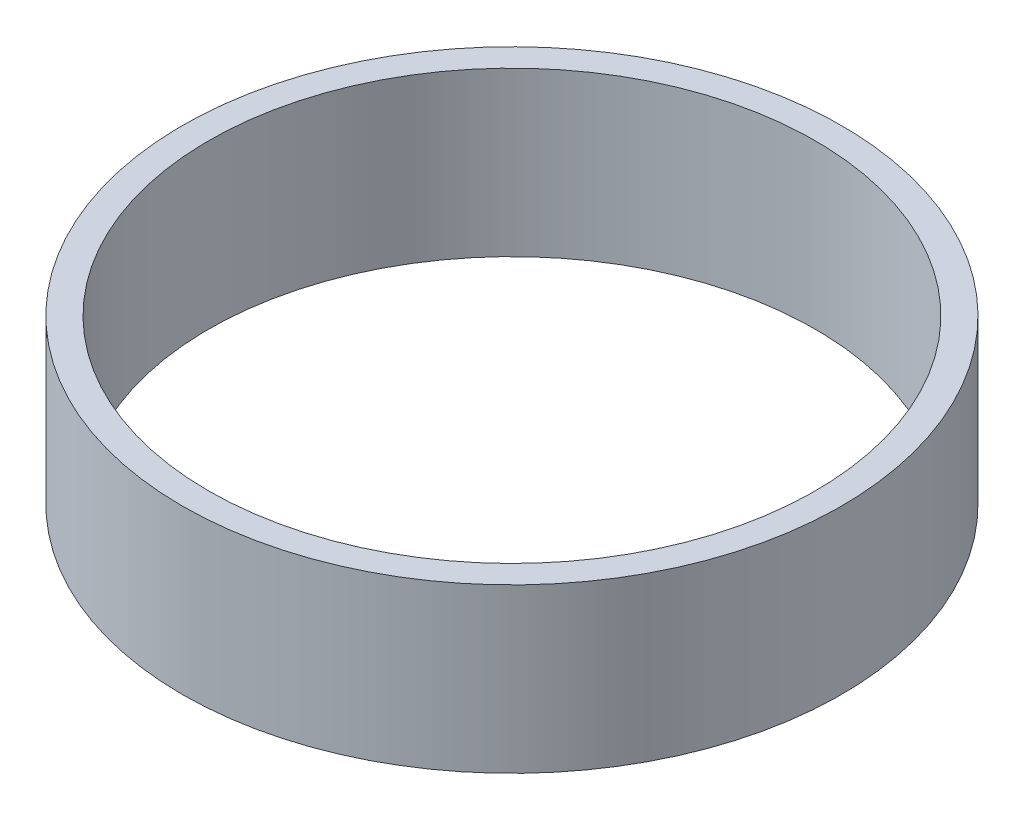
ISO-10303-21;
HEADER;
FILE_DESCRIPTION(('STEP AP214'),'2;1');
FILE_NAME('part.step','',(''),(''),'','','');
FILE_SCHEMA(('AUTOMOTIVE_DESIGN { 1 0 10303 214 1 1 1 1 }'));
ENDSEC;
DATA;
#1=APPLICATION_CONTEXT('core data for automotive mechanical design processes');
#2=APPLICATION_PROTOCOL_DEFINITION('international standard','automotive_design',2000,#1);
#3=PRODUCT_CONTEXT('',#1,'mechanical');
#4=PRODUCT('Part','Part','',(#3));
#5=PRODUCT_RELATED_PRODUCT_CATEGORY('part','',(#4));
#6=PRODUCT_DEFINITION_FORMATION('','',#4);
#7=PRODUCT_DEFINITION_CONTEXT('part definition',#1,'design');
#8=PRODUCT_DEFINITION('design','',#6,#7);
#9=PRODUCT_DEFINITION_SHAPE('','',#8);
#10=(LENGTH_UNIT() NAMED_UNIT(*) SI_UNIT(.MILLI.,.METRE.));
#11=(NAMED_UNIT(*) PLANE_ANGLE_UNIT() SI_UNIT($,.RADIAN.));
#12=(NAMED_UNIT(*) SI_UNIT($,.STERADIAN.) SOLID_ANGLE_UNIT());
#13=UNCERTAINTY_MEASURE_WITH_UNIT(LENGTH_MEASURE(1.E-05),#10,'distance_accuracy_value','');
#14=(GEOMETRIC_REPRESENTATION_CONTEXT(3) GLOBAL_UNCERTAINTY_ASSIGNED_CONTEXT((#13)) GLOBAL_UNIT_ASSIGNED_CONTEXT((#10,
#11,#12)) REPRESENTATION_CONTEXT('',''));
#15=CARTESIAN_POINT('',(0.,0.,0.));
#16=DIRECTION('',(0.,0.,1.));
#17=DIRECTION('',(1.,0.,0.));
#18=AXIS2_PLACEMENT_3D('',#15,#16,#17);
#19=CARTESIAN_POINT('',(0.,6.,0.));
#20=DIRECTION('',(0.,-1.,0.));
#21=DIRECTION('',(0.,0.,-1.));
#22=AXIS2_PLACEMENT_3D('',#19,#20,#21);
#23=CYLINDRICAL_SURFACE('',#22,12.115);
#24=CARTESIAN_POINT('',(0.,6.,0.));
#25=DIRECTION('',(0.,1.,0.));
#26=DIRECTION('',(0.,0.,1.));
#27=AXIS2_PLACEMENT_3D('',#24,#25,#26);
#28=CIRCLE('',#27,12.115);
#29=CARTESIAN_POINT('',(0.,6.,12.115));
#30=VERTEX_POINT('',#29);
#31=EDGE_CURVE('E10',#30,#30,#28,.T.);
#32=ORIENTED_EDGE('',*,*,#31,.F.);
#33=EDGE_LOOP('',(#32));
#34=FACE_BOUND('',#33,.T.);
#35=CARTESIAN_POINT('',(0.,0.,0.));
#36=DIRECTION('',(0.,1.,0.));
#37=DIRECTION('',(0.,0.,1.));
#38=AXIS2_PLACEMENT_3D('',#35,#36,#37);
#39=CIRCLE('',#38,12.115);
#40=CARTESIAN_POINT('',(0.,0.,12.115));
#41=VERTEX_POINT('',#40);
#42=EDGE_CURVE('E41',#41,#41,#39,.T.);
#43=ORIENTED_EDGE('',*,*,#42,.T.);
#44=EDGE_LOOP('',(#43));
#45=FACE_BOUND('',#44,.T.);
#46=ADVANCED_FACE('F34',(#34,#45),#23,.T.);
#47=CARTESIAN_POINT('',(0.,6.,0.));
#48=DIRECTION('',(0.,1.,0.));
#49=DIRECTION('',(0.,0.,1.));
#50=AXIS2_PLACEMENT_3D('',#47,#48,#49);
#51=PLANE('',#50);
#52=CARTESIAN_POINT('',(0.,6.,0.));
#53=DIRECTION('',(0.,1.,0.));
#54=DIRECTION('',(0.,0.,1.));
#55=AXIS2_PLACEMENT_3D('',#52,#53,#54);
#56=CIRCLE('',#55,11.15);
#57=CARTESIAN_POINT('',(0.,6.,11.15));
#58=VERTEX_POINT('',#57);
#59=EDGE_CURVE('E47',#58,#58,#56,.T.);
#60=ORIENTED_EDGE('',*,*,#59,.F.);
#61=EDGE_LOOP('',(#60));
#62=FACE_BOUND('',#61,.T.);
#63=ORIENTED_EDGE('',*,*,#31,.T.);
#64=EDGE_LOOP('',(#63));
#65=FACE_BOUND('',#64,.T.);
#66=ADVANCED_FACE('F63',(#62,#65),#51,.T.);
#67=CARTESIAN_POINT('',(0.,0.,0.));
#68=DIRECTION('',(0.,1.,0.));
#69=DIRECTION('',(0.,0.,1.));
#70=AXIS2_PLACEMENT_3D('',#67,#68,#69);
#71=PLANE('',#70);
#72=CARTESIAN_POINT('',(0.,0.,0.));
#73=DIRECTION('',(0.,1.,0.));
#74=DIRECTION('',(0.,0.,1.));
#75=AXIS2_PLACEMENT_3D('',#72,#73,#74);
#76=CIRCLE('',#75,11.15);
#77=CARTESIAN_POINT('',(0.,0.,11.15));
#78=VERTEX_POINT('',#77);
#79=EDGE_CURVE('E37',#78,#78,#76,.T.);
#80=ORIENTED_EDGE('',*,*,#79,.T.);
#81=EDGE_LOOP('',(#80));
#82=FACE_BOUND('',#81,.T.);
#83=ORIENTED_EDGE('',*,*,#42,.F.);
#84=EDGE_LOOP('',(#83));
#85=FACE_BOUND('',#84,.T.);
#86=ADVANCED_FACE('F54',(#82,#85),#71,.F.);
#87=CARTESIAN_POINT('',(0.,-4.,0.));
#88=DIRECTION('',(0.,1.,0.));
#89=DIRECTION('',(0.,0.,1.));
#90=AXIS2_PLACEMENT_3D('',#87,#88,#89);
#91=CYLINDRICAL_SURFACE('',#90,11.15);
#92=ORIENTED_EDGE('',*,*,#59,.T.);
#93=EDGE_LOOP('',(#92));
#94=FACE_BOUND('',#93,.T.);
#95=ORIENTED_EDGE('',*,*,#79,.F.);
#96=EDGE_LOOP('',(#95));
#97=FACE_BOUND('',#96,.T.);
#98=ADVANCED_FACE('F57',(#94,#97),#91,.F.);
#99=CLOSED_SHELL('',(#46,#66,#86,#98));
#100=MANIFOLD_SOLID_BREP('B2',#99);
#101=ADVANCED_BREP_SHAPE_REPRESENTATION('',(#18,#100),#14);
#102=SHAPE_DEFINITION_REPRESENTATION(#9,#101);
ENDSEC;
END-ISO-10303-21;
